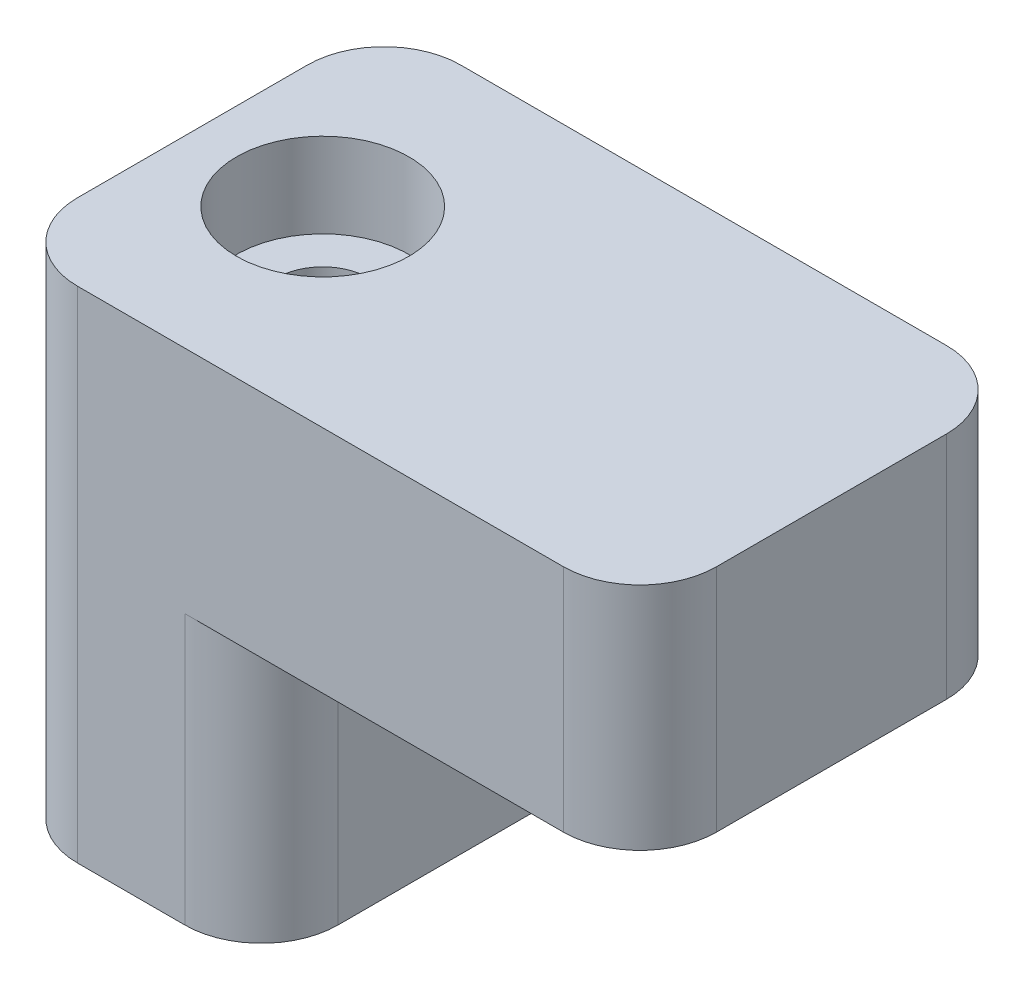
ISO-10303-21;
HEADER;
FILE_DESCRIPTION(('STEP AP214'),'2;1');
FILE_NAME('part.step','',(''),(''),'','','');
FILE_SCHEMA(('AUTOMOTIVE_DESIGN { 1 0 10303 214 1 1 1 1 }'));
ENDSEC;
DATA;
#1=APPLICATION_CONTEXT('core data for automotive mechanical design processes');
#2=APPLICATION_PROTOCOL_DEFINITION('international standard','automotive_design',2000,#1);
#3=PRODUCT_CONTEXT('',#1,'mechanical');
#4=PRODUCT('Part','Part','',(#3));
#5=PRODUCT_RELATED_PRODUCT_CATEGORY('part','',(#4));
#6=PRODUCT_DEFINITION_FORMATION('','',#4);
#7=PRODUCT_DEFINITION_CONTEXT('part definition',#1,'design');
#8=PRODUCT_DEFINITION('design','',#6,#7);
#9=PRODUCT_DEFINITION_SHAPE('','',#8);
#10=(LENGTH_UNIT() NAMED_UNIT(*) SI_UNIT(.MILLI.,.METRE.));
#11=(NAMED_UNIT(*) PLANE_ANGLE_UNIT() SI_UNIT($,.RADIAN.));
#12=(NAMED_UNIT(*) SI_UNIT($,.STERADIAN.) SOLID_ANGLE_UNIT());
#13=UNCERTAINTY_MEASURE_WITH_UNIT(LENGTH_MEASURE(1.E-05),#10,'distance_accuracy_value','');
#14=(GEOMETRIC_REPRESENTATION_CONTEXT(3) GLOBAL_UNCERTAINTY_ASSIGNED_CONTEXT((#13)) GLOBAL_UNIT_ASSIGNED_CONTEXT((#10,
#11,#12)) REPRESENTATION_CONTEXT('',''));
#15=CARTESIAN_POINT('',(0.,0.,0.));
#16=DIRECTION('',(0.,0.,1.));
#17=DIRECTION('',(1.,0.,0.));
#18=AXIS2_PLACEMENT_3D('',#15,#16,#17);
#19=CARTESIAN_POINT('',(10.795,0.,-15.875));
#20=DIRECTION('',(0.,-1.,0.));
#21=DIRECTION('',(1.,0.,0.));
#22=AXIS2_PLACEMENT_3D('',#19,#20,#21);
#23=PLANE('',#22);
#24=CARTESIAN_POINT('',(5.3975,0.,-7.9375));
#25=DIRECTION('',(0.,1.,0.));
#26=DIRECTION('',(0.,0.,1.));
#27=AXIS2_PLACEMENT_3D('',#24,#25,#26);
#28=CIRCLE('',#27,1.89864999999999);
#29=CARTESIAN_POINT('',(5.3975,0.,-6.03885));
#30=VERTEX_POINT('',#29);
#31=EDGE_CURVE('E254',#30,#30,#28,.T.);
#32=ORIENTED_EDGE('',*,*,#31,.T.);
#33=EDGE_LOOP('',(#32));
#34=FACE_BOUND('',#33,.T.);
#35=DIRECTION('',(1.,0.,0.));
#36=VECTOR('',#35,1.);
#37=CARTESIAN_POINT('',(10.795,0.,-15.875));
#38=LINE('',#37,#36);
#39=CARTESIAN_POINT('',(3.175,0.,-15.875));
#40=VERTEX_POINT('',#39);
#41=CARTESIAN_POINT('',(7.62,0.,-15.875));
#42=VERTEX_POINT('',#41);
#43=EDGE_CURVE('E258',#40,#42,#38,.T.);
#44=ORIENTED_EDGE('',*,*,#43,.T.);
#45=CARTESIAN_POINT('',(7.62,0.,-12.7));
#46=DIRECTION('',(0.,-1.,0.));
#47=DIRECTION('',(1.,0.,0.));
#48=AXIS2_PLACEMENT_3D('',#45,#46,#47);
#49=CIRCLE('',#48,3.175);
#50=CARTESIAN_POINT('',(10.795,0.,-12.7));
#51=VERTEX_POINT('',#50);
#52=EDGE_CURVE('E307',#42,#51,#49,.T.);
#53=ORIENTED_EDGE('',*,*,#52,.T.);
#54=DIRECTION('',(0.,0.,1.));
#55=VECTOR('',#54,1.);
#56=CARTESIAN_POINT('',(10.795,0.,-15.875));
#57=LINE('',#56,#55);
#58=CARTESIAN_POINT('',(10.795,0.,-3.175));
#59=VERTEX_POINT('',#58);
#60=EDGE_CURVE('E267',#51,#59,#57,.T.);
#61=ORIENTED_EDGE('',*,*,#60,.T.);
#62=CARTESIAN_POINT('',(7.62,0.,-3.175));
#63=DIRECTION('',(0.,-1.,0.));
#64=DIRECTION('',(1.,0.,0.));
#65=AXIS2_PLACEMENT_3D('',#62,#63,#64);
#66=CIRCLE('',#65,3.175);
#67=CARTESIAN_POINT('',(7.62,0.,0.));
#68=VERTEX_POINT('',#67);
#69=EDGE_CURVE('E305',#59,#68,#66,.T.);
#70=ORIENTED_EDGE('',*,*,#69,.T.);
#71=DIRECTION('',(1.,0.,0.));
#72=VECTOR('',#71,1.);
#73=CARTESIAN_POINT('',(10.795,0.,0.));
#74=LINE('',#73,#72);
#75=CARTESIAN_POINT('',(3.175,0.,0.));
#76=VERTEX_POINT('',#75);
#77=EDGE_CURVE('E257',#76,#68,#74,.T.);
#78=ORIENTED_EDGE('',*,*,#77,.F.);
#79=CARTESIAN_POINT('',(3.175,0.,-3.175));
#80=DIRECTION('',(0.,-1.,0.));
#81=DIRECTION('',(1.,0.,0.));
#82=AXIS2_PLACEMENT_3D('',#79,#80,#81);
#83=CIRCLE('',#82,3.175);
#84=CARTESIAN_POINT('',(0.,0.,-3.175));
#85=VERTEX_POINT('',#84);
#86=EDGE_CURVE('E301',#76,#85,#83,.T.);
#87=ORIENTED_EDGE('',*,*,#86,.T.);
#88=DIRECTION('',(0.,0.,1.));
#89=VECTOR('',#88,1.);
#90=CARTESIAN_POINT('',(0.,0.,-15.875));
#91=LINE('',#90,#89);
#92=CARTESIAN_POINT('',(0.,0.,-12.7));
#93=VERTEX_POINT('',#92);
#94=EDGE_CURVE('E275',#93,#85,#91,.T.);
#95=ORIENTED_EDGE('',*,*,#94,.F.);
#96=CARTESIAN_POINT('',(3.175,0.,-12.7));
#97=DIRECTION('',(0.,-1.,0.));
#98=DIRECTION('',(1.,0.,0.));
#99=AXIS2_PLACEMENT_3D('',#96,#97,#98);
#100=CIRCLE('',#99,3.175);
#101=EDGE_CURVE('E303',#93,#40,#100,.T.);
#102=ORIENTED_EDGE('',*,*,#101,.T.);
#103=EDGE_LOOP('',(#44,#53,#61,#70,#78,#87,#95,#102));
#104=FACE_BOUND('',#103,.T.);
#105=ADVANCED_FACE('F33',(#34,#104),#23,.T.);
#106=CARTESIAN_POINT('',(0.,0.,-15.875));
#107=DIRECTION('',(-1.,0.,0.));
#108=DIRECTION('',(0.,0.,1.));
#109=AXIS2_PLACEMENT_3D('',#106,#107,#108);
#110=PLANE('',#109);
#111=DIRECTION('',(0.,0.,1.));
#112=VECTOR('',#111,1.);
#113=CARTESIAN_POINT('',(0.,20.701,-15.875));
#114=LINE('',#113,#112);
#115=CARTESIAN_POINT('',(0.,20.701,-12.7));
#116=VERTEX_POINT('',#115);
#117=CARTESIAN_POINT('',(0.,20.701,-3.175));
#118=VERTEX_POINT('',#117);
#119=EDGE_CURVE('E279',#116,#118,#114,.T.);
#120=ORIENTED_EDGE('',*,*,#119,.F.);
#121=DIRECTION('',(0.,-1.,0.));
#122=VECTOR('',#121,1.);
#123=CARTESIAN_POINT('',(0.,0.,-12.7));
#124=LINE('',#123,#122);
#125=EDGE_CURVE('E320',#116,#93,#124,.T.);
#126=ORIENTED_EDGE('',*,*,#125,.T.);
#127=ORIENTED_EDGE('',*,*,#94,.T.);
#128=DIRECTION('',(0.,-1.,0.));
#129=VECTOR('',#128,1.);
#130=CARTESIAN_POINT('',(0.,20.701,-3.175));
#131=LINE('',#130,#129);
#132=EDGE_CURVE('E318',#85,#118,#131,.F.);
#133=ORIENTED_EDGE('',*,*,#132,.T.);
#134=EDGE_LOOP('',(#120,#126,#127,#133));
#135=FACE_BOUND('',#134,.T.);
#136=ADVANCED_FACE('F358',(#135),#110,.T.);
#137=CARTESIAN_POINT('',(0.,20.701,-15.875));
#138=DIRECTION('',(0.,1.,0.));
#139=DIRECTION('',(-1.,0.,0.));
#140=AXIS2_PLACEMENT_3D('',#137,#138,#139);
#141=PLANE('',#140);
#142=CARTESIAN_POINT('',(5.3975,20.701,-7.9375));
#143=DIRECTION('',(0.,1.,0.));
#144=DIRECTION('',(0.,0.,1.));
#145=AXIS2_PLACEMENT_3D('',#142,#143,#144);
#146=CIRCLE('',#145,3.57250999999999);
#147=CARTESIAN_POINT('',(5.3975,20.701,-4.36499));
#148=VERTEX_POINT('',#147);
#149=EDGE_CURVE('E239',#148,#148,#146,.T.);
#150=ORIENTED_EDGE('',*,*,#149,.F.);
#151=EDGE_LOOP('',(#150));
#152=FACE_BOUND('',#151,.T.);
#153=DIRECTION('',(-1.,0.,0.));
#154=VECTOR('',#153,1.);
#155=CARTESIAN_POINT('',(0.,20.701,-15.875));
#156=LINE('',#155,#154);
#157=CARTESIAN_POINT('',(23.3045,20.701,-15.875));
#158=VERTEX_POINT('',#157);
#159=CARTESIAN_POINT('',(3.175,20.701,-15.875));
#160=VERTEX_POINT('',#159);
#161=EDGE_CURVE('E264',#158,#160,#156,.T.);
#162=ORIENTED_EDGE('',*,*,#161,.T.);
#163=CARTESIAN_POINT('',(3.175,20.701,-12.7));
#164=DIRECTION('',(0.,1.,0.));
#165=DIRECTION('',(-1.,0.,0.));
#166=AXIS2_PLACEMENT_3D('',#163,#164,#165);
#167=CIRCLE('',#166,3.175);
#168=EDGE_CURVE('E329',#160,#116,#167,.T.);
#169=ORIENTED_EDGE('',*,*,#168,.T.);
#170=ORIENTED_EDGE('',*,*,#119,.T.);
#171=CARTESIAN_POINT('',(3.175,20.701,-3.175));
#172=DIRECTION('',(0.,1.,0.));
#173=DIRECTION('',(-1.,0.,0.));
#174=AXIS2_PLACEMENT_3D('',#171,#172,#173);
#175=CIRCLE('',#174,3.175);
#176=CARTESIAN_POINT('',(3.175,20.701,0.));
#177=VERTEX_POINT('',#176);
#178=EDGE_CURVE('E327',#118,#177,#175,.T.);
#179=ORIENTED_EDGE('',*,*,#178,.T.);
#180=DIRECTION('',(-1.,0.,0.));
#181=VECTOR('',#180,1.);
#182=CARTESIAN_POINT('',(0.,20.701,0.));
#183=LINE('',#182,#181);
#184=CARTESIAN_POINT('',(23.3045,20.701,0.));
#185=VERTEX_POINT('',#184);
#186=EDGE_CURVE('E262',#185,#177,#183,.T.);
#187=ORIENTED_EDGE('',*,*,#186,.F.);
#188=CARTESIAN_POINT('',(23.3045,20.701,-3.175));
#189=DIRECTION('',(0.,1.,0.));
#190=DIRECTION('',(-1.,0.,0.));
#191=AXIS2_PLACEMENT_3D('',#188,#189,#190);
#192=CIRCLE('',#191,3.175);
#193=CARTESIAN_POINT('',(26.4795,20.701,-3.175));
#194=VERTEX_POINT('',#193);
#195=EDGE_CURVE('E323',#185,#194,#192,.T.);
#196=ORIENTED_EDGE('',*,*,#195,.T.);
#197=DIRECTION('',(0.,0.,1.));
#198=VECTOR('',#197,1.);
#199=CARTESIAN_POINT('',(26.4795,20.701,-15.875));
#200=LINE('',#199,#198);
#201=CARTESIAN_POINT('',(26.4795,20.701,-12.7));
#202=VERTEX_POINT('',#201);
#203=EDGE_CURVE('E282',#202,#194,#200,.T.);
#204=ORIENTED_EDGE('',*,*,#203,.F.);
#205=CARTESIAN_POINT('',(23.3045,20.701,-12.7));
#206=DIRECTION('',(0.,1.,0.));
#207=DIRECTION('',(-1.,0.,0.));
#208=AXIS2_PLACEMENT_3D('',#205,#206,#207);
#209=CIRCLE('',#208,3.175);
#210=EDGE_CURVE('E325',#202,#158,#209,.T.);
#211=ORIENTED_EDGE('',*,*,#210,.T.);
#212=EDGE_LOOP('',(#162,#169,#170,#179,#187,#196,#204,#211));
#213=FACE_BOUND('',#212,.T.);
#214=ADVANCED_FACE('F362',(#152,#213),#141,.T.);
#215=CARTESIAN_POINT('',(26.4795,20.701,-15.875));
#216=DIRECTION('',(1.,0.,0.));
#217=DIRECTION('',(0.,0.,-1.));
#218=AXIS2_PLACEMENT_3D('',#215,#216,#217);
#219=PLANE('',#218);
#220=DIRECTION('',(0.,0.,1.));
#221=VECTOR('',#220,1.);
#222=CARTESIAN_POINT('',(26.4795,11.176,-15.875));
#223=LINE('',#222,#221);
#224=CARTESIAN_POINT('',(26.4795,11.176,-12.7));
#225=VERTEX_POINT('',#224);
#226=CARTESIAN_POINT('',(26.4795,11.176,-3.175));
#227=VERTEX_POINT('',#226);
#228=EDGE_CURVE('E284',#225,#227,#223,.T.);
#229=ORIENTED_EDGE('',*,*,#228,.F.);
#230=DIRECTION('',(0.,1.,0.));
#231=VECTOR('',#230,1.);
#232=CARTESIAN_POINT('',(26.4795,20.701,-12.7));
#233=LINE('',#232,#231);
#234=EDGE_CURVE('E332',#225,#202,#233,.T.);
#235=ORIENTED_EDGE('',*,*,#234,.T.);
#236=ORIENTED_EDGE('',*,*,#203,.T.);
#237=DIRECTION('',(0.,1.,0.));
#238=VECTOR('',#237,1.);
#239=CARTESIAN_POINT('',(26.4795,11.176,-3.175));
#240=LINE('',#239,#238);
#241=EDGE_CURVE('E48',#194,#227,#240,.F.);
#242=ORIENTED_EDGE('',*,*,#241,.T.);
#243=EDGE_LOOP('',(#229,#235,#236,#242));
#244=FACE_BOUND('',#243,.T.);
#245=ADVANCED_FACE('F380',(#244),#219,.T.);
#246=CARTESIAN_POINT('',(26.4795,11.176,-15.875));
#247=DIRECTION('',(0.,-1.,0.));
#248=DIRECTION('',(1.,0.,0.));
#249=AXIS2_PLACEMENT_3D('',#246,#247,#248);
#250=PLANE('',#249);
#251=CARTESIAN_POINT('',(20.3835,11.176,-13.2715));
#252=DIRECTION('',(0.,-1.,0.));
#253=DIRECTION('',(1.,0.,0.));
#254=AXIS2_PLACEMENT_3D('',#251,#252,#253);
#255=CIRCLE('',#254,0.396875000000001);
#256=CARTESIAN_POINT('',(20.3835,11.176,-12.874625));
#257=VERTEX_POINT('',#256);
#258=CARTESIAN_POINT('',(20.3835,11.176,-13.668375));
#259=VERTEX_POINT('',#258);
#260=EDGE_CURVE('E178',#257,#259,#255,.T.);
#261=ORIENTED_EDGE('',*,*,#260,.F.);
#262=DIRECTION('',(-1.,0.,0.));
#263=VECTOR('',#262,1.);
#264=CARTESIAN_POINT('',(20.3835,11.176,-12.874625));
#265=LINE('',#264,#263);
#266=CARTESIAN_POINT('',(24.9555,11.176,-12.874625));
#267=VERTEX_POINT('',#266);
#268=EDGE_CURVE('E195',#267,#257,#265,.T.);
#269=ORIENTED_EDGE('',*,*,#268,.F.);
#270=CARTESIAN_POINT('',(24.9555,11.176,-13.2715));
#271=DIRECTION('',(0.,-1.,0.));
#272=DIRECTION('',(1.,0.,0.));
#273=AXIS2_PLACEMENT_3D('',#270,#271,#272);
#274=CIRCLE('',#273,0.396875000000001);
#275=CARTESIAN_POINT('',(24.9555,11.176,-13.668375));
#276=VERTEX_POINT('',#275);
#277=EDGE_CURVE('E198',#276,#267,#274,.T.);
#278=ORIENTED_EDGE('',*,*,#277,.F.);
#279=DIRECTION('',(1.,0.,0.));
#280=VECTOR('',#279,1.);
#281=CARTESIAN_POINT('',(20.3835,11.176,-13.668375));
#282=LINE('',#281,#280);
#283=EDGE_CURVE('E204',#259,#276,#282,.T.);
#284=ORIENTED_EDGE('',*,*,#283,.F.);
#285=EDGE_LOOP('',(#261,#269,#278,#284));
#286=FACE_BOUND('',#285,.T.);
#287=CARTESIAN_POINT('',(20.3835,11.176,-2.6035));
#288=DIRECTION('',(0.,-1.,0.));
#289=DIRECTION('',(1.,0.,0.));
#290=AXIS2_PLACEMENT_3D('',#287,#288,#289);
#291=CIRCLE('',#290,0.396875);
#292=CARTESIAN_POINT('',(20.3835,11.176,-2.206625));
#293=VERTEX_POINT('',#292);
#294=CARTESIAN_POINT('',(20.3835,11.176,-3.000375));
#295=VERTEX_POINT('',#294);
#296=EDGE_CURVE('E210',#293,#295,#291,.T.);
#297=ORIENTED_EDGE('',*,*,#296,.F.);
#298=DIRECTION('',(-1.,0.,0.));
#299=VECTOR('',#298,1.);
#300=CARTESIAN_POINT('',(20.3835,11.176,-2.206625));
#301=LINE('',#300,#299);
#302=CARTESIAN_POINT('',(24.9555,11.176,-2.206625));
#303=VERTEX_POINT('',#302);
#304=EDGE_CURVE('E218',#303,#293,#301,.T.);
#305=ORIENTED_EDGE('',*,*,#304,.F.);
#306=CARTESIAN_POINT('',(24.9555,11.176,-2.6035));
#307=DIRECTION('',(0.,-1.,0.));
#308=DIRECTION('',(1.,0.,0.));
#309=AXIS2_PLACEMENT_3D('',#306,#307,#308);
#310=CIRCLE('',#309,0.396875);
#311=CARTESIAN_POINT('',(24.9555,11.176,-3.000375));
#312=VERTEX_POINT('',#311);
#313=EDGE_CURVE('E232',#312,#303,#310,.T.);
#314=ORIENTED_EDGE('',*,*,#313,.F.);
#315=DIRECTION('',(1.,0.,0.));
#316=VECTOR('',#315,1.);
#317=CARTESIAN_POINT('',(20.3835,11.176,-3.000375));
#318=LINE('',#317,#316);
#319=EDGE_CURVE('E229',#295,#312,#318,.T.);
#320=ORIENTED_EDGE('',*,*,#319,.F.);
#321=EDGE_LOOP('',(#297,#305,#314,#320));
#322=FACE_BOUND('',#321,.T.);
#323=DIRECTION('',(1.,0.,0.));
#324=VECTOR('',#323,1.);
#325=CARTESIAN_POINT('',(26.4795,11.176,-15.875));
#326=LINE('',#325,#324);
#327=CARTESIAN_POINT('',(7.62,11.176,-15.875));
#328=VERTEX_POINT('',#327);
#329=CARTESIAN_POINT('',(23.3045,11.176,-15.875));
#330=VERTEX_POINT('',#329);
#331=EDGE_CURVE('E261',#328,#330,#326,.T.);
#332=ORIENTED_EDGE('',*,*,#331,.T.);
#333=CARTESIAN_POINT('',(23.3045,11.176,-12.7));
#334=DIRECTION('',(0.,-1.,0.));
#335=DIRECTION('',(1.,0.,0.));
#336=AXIS2_PLACEMENT_3D('',#333,#334,#335);
#337=CIRCLE('',#336,3.175);
#338=EDGE_CURVE('E55',#330,#225,#337,.T.);
#339=ORIENTED_EDGE('',*,*,#338,.T.);
#340=ORIENTED_EDGE('',*,*,#228,.T.);
#341=CARTESIAN_POINT('',(23.3045,11.176,-3.175));
#342=DIRECTION('',(0.,-1.,0.));
#343=DIRECTION('',(1.,0.,0.));
#344=AXIS2_PLACEMENT_3D('',#341,#342,#343);
#345=CIRCLE('',#344,3.175);
#346=CARTESIAN_POINT('',(23.3045,11.176,0.));
#347=VERTEX_POINT('',#346);
#348=EDGE_CURVE('E335',#227,#347,#345,.T.);
#349=ORIENTED_EDGE('',*,*,#348,.T.);
#350=DIRECTION('',(1.,0.,0.));
#351=VECTOR('',#350,1.);
#352=CARTESIAN_POINT('',(26.4795,11.176,0.));
#353=LINE('',#352,#351);
#354=CARTESIAN_POINT('',(7.62,11.176,0.));
#355=VERTEX_POINT('',#354);
#356=EDGE_CURVE('E270',#355,#347,#353,.T.);
#357=ORIENTED_EDGE('',*,*,#356,.F.);
#358=CARTESIAN_POINT('',(7.62,11.176,-3.175));
#359=DIRECTION('',(0.,-1.,0.));
#360=DIRECTION('',(1.,0.,0.));
#361=AXIS2_PLACEMENT_3D('',#358,#359,#360);
#362=CIRCLE('',#361,3.175);
#363=CARTESIAN_POINT('',(10.795,11.176,-3.175));
#364=VERTEX_POINT('',#363);
#365=EDGE_CURVE('E11',#355,#364,#362,.F.);
#366=ORIENTED_EDGE('',*,*,#365,.T.);
#367=DIRECTION('',(0.,0.,1.));
#368=VECTOR('',#367,1.);
#369=CARTESIAN_POINT('',(10.795,11.176,-15.875));
#370=LINE('',#369,#368);
#371=CARTESIAN_POINT('',(10.795,11.176,-12.7));
#372=VERTEX_POINT('',#371);
#373=EDGE_CURVE('E286',#372,#364,#370,.T.);
#374=ORIENTED_EDGE('',*,*,#373,.F.);
#375=CARTESIAN_POINT('',(7.62,11.176,-12.7));
#376=DIRECTION('',(0.,-1.,0.));
#377=DIRECTION('',(1.,0.,0.));
#378=AXIS2_PLACEMENT_3D('',#375,#376,#377);
#379=CIRCLE('',#378,3.175);
#380=EDGE_CURVE('E41',#372,#328,#379,.F.);
#381=ORIENTED_EDGE('',*,*,#380,.T.);
#382=EDGE_LOOP('',(#332,#339,#340,#349,#357,#366,#374,#381));
#383=FACE_BOUND('',#382,.T.);
#384=ADVANCED_FACE('F340',(#286,#322,#383),#250,.T.);
#385=CARTESIAN_POINT('',(10.795,11.176,-15.875));
#386=DIRECTION('',(1.,0.,0.));
#387=DIRECTION('',(0.,1.,0.));
#388=AXIS2_PLACEMENT_3D('',#385,#386,#387);
#389=PLANE('',#388);
#390=ORIENTED_EDGE('',*,*,#60,.F.);
#391=DIRECTION('',(0.,1.,0.));
#392=VECTOR('',#391,1.);
#393=CARTESIAN_POINT('',(10.795,11.176,-12.7));
#394=LINE('',#393,#392);
#395=EDGE_CURVE('E292',#51,#372,#394,.T.);
#396=ORIENTED_EDGE('',*,*,#395,.T.);
#397=ORIENTED_EDGE('',*,*,#373,.T.);
#398=DIRECTION('',(0.,1.,0.));
#399=VECTOR('',#398,1.);
#400=CARTESIAN_POINT('',(10.795,0.,-3.175));
#401=LINE('',#400,#399);
#402=EDGE_CURVE('E278',#364,#59,#401,.F.);
#403=ORIENTED_EDGE('',*,*,#402,.T.);
#404=EDGE_LOOP('',(#390,#396,#397,#403));
#405=FACE_BOUND('',#404,.T.);
#406=ADVANCED_FACE('F402',(#405),#389,.T.);
#407=CARTESIAN_POINT('',(0.,0.,-15.875));
#408=DIRECTION('',(0.,0.,-1.));
#409=DIRECTION('',(-1.,0.,0.));
#410=AXIS2_PLACEMENT_3D('',#407,#408,#409);
#411=PLANE('',#410);
#412=ORIENTED_EDGE('',*,*,#331,.F.);
#413=DIRECTION('',(0.,1.,0.));
#414=VECTOR('',#413,1.);
#415=CARTESIAN_POINT('',(7.62,0.,-15.875));
#416=LINE('',#415,#414);
#417=EDGE_CURVE('E299',#328,#42,#416,.F.);
#418=ORIENTED_EDGE('',*,*,#417,.T.);
#419=ORIENTED_EDGE('',*,*,#43,.F.);
#420=DIRECTION('',(0.,-1.,0.));
#421=VECTOR('',#420,1.);
#422=CARTESIAN_POINT('',(3.175,0.,-15.875));
#423=LINE('',#422,#421);
#424=EDGE_CURVE('E297',#40,#160,#423,.F.);
#425=ORIENTED_EDGE('',*,*,#424,.T.);
#426=ORIENTED_EDGE('',*,*,#161,.F.);
#427=DIRECTION('',(0.,1.,0.));
#428=VECTOR('',#427,1.);
#429=CARTESIAN_POINT('',(23.3045,0.,-15.875));
#430=LINE('',#429,#428);
#431=EDGE_CURVE('E295',#158,#330,#430,.F.);
#432=ORIENTED_EDGE('',*,*,#431,.T.);
#433=EDGE_LOOP('',(#412,#418,#419,#425,#426,#432));
#434=FACE_BOUND('',#433,.T.);
#435=ADVANCED_FACE('F347',(#434),#411,.T.);
#436=CARTESIAN_POINT('',(0.,0.,0.));
#437=DIRECTION('',(0.,0.,-1.));
#438=DIRECTION('',(-1.,0.,0.));
#439=AXIS2_PLACEMENT_3D('',#436,#437,#438);
#440=PLANE('',#439);
#441=ORIENTED_EDGE('',*,*,#77,.T.);
#442=DIRECTION('',(0.,1.,0.));
#443=VECTOR('',#442,1.);
#444=CARTESIAN_POINT('',(7.62,11.176,0.));
#445=LINE('',#444,#443);
#446=EDGE_CURVE('E315',#68,#355,#445,.T.);
#447=ORIENTED_EDGE('',*,*,#446,.T.);
#448=ORIENTED_EDGE('',*,*,#356,.T.);
#449=DIRECTION('',(0.,1.,0.));
#450=VECTOR('',#449,1.);
#451=CARTESIAN_POINT('',(23.3045,20.701,0.));
#452=LINE('',#451,#450);
#453=EDGE_CURVE('E309',#347,#185,#452,.T.);
#454=ORIENTED_EDGE('',*,*,#453,.T.);
#455=ORIENTED_EDGE('',*,*,#186,.T.);
#456=DIRECTION('',(0.,-1.,0.));
#457=VECTOR('',#456,1.);
#458=CARTESIAN_POINT('',(3.175,0.,0.));
#459=LINE('',#458,#457);
#460=EDGE_CURVE('E312',#177,#76,#459,.T.);
#461=ORIENTED_EDGE('',*,*,#460,.T.);
#462=EDGE_LOOP('',(#441,#447,#448,#454,#455,#461));
#463=FACE_BOUND('',#462,.T.);
#464=ADVANCED_FACE('F369',(#463),#440,.F.);
#465=CARTESIAN_POINT('',(5.3975,20.701,-7.9375));
#466=DIRECTION('',(0.,1.,0.));
#467=DIRECTION('',(0.,0.,1.));
#468=AXIS2_PLACEMENT_3D('',#465,#466,#467);
#469=CYLINDRICAL_SURFACE('',#468,1.89865);
#470=ORIENTED_EDGE('',*,*,#31,.F.);
#471=EDGE_LOOP('',(#470));
#472=FACE_BOUND('',#471,.T.);
#473=CARTESIAN_POINT('',(5.3975,17.1958,-7.9375));
#474=DIRECTION('',(0.,1.,0.));
#475=DIRECTION('',(0.,0.,1.));
#476=AXIS2_PLACEMENT_3D('',#473,#474,#475);
#477=CIRCLE('',#476,1.89865);
#478=CARTESIAN_POINT('',(5.3975,17.1958,-6.03885));
#479=VERTEX_POINT('',#478);
#480=EDGE_CURVE('E251',#479,#479,#477,.T.);
#481=ORIENTED_EDGE('',*,*,#480,.T.);
#482=EDGE_LOOP('',(#481));
#483=FACE_BOUND('',#482,.T.);
#484=ADVANCED_FACE('F542',(#472,#483),#469,.F.);
#485=CARTESIAN_POINT('',(7.29615,17.1958,-7.9375));
#486=DIRECTION('',(0.,-1.,0.));
#487=DIRECTION('',(0.,0.,-1.));
#488=AXIS2_PLACEMENT_3D('',#485,#486,#487);
#489=PLANE('',#488);
#490=ORIENTED_EDGE('',*,*,#480,.F.);
#491=EDGE_LOOP('',(#490));
#492=FACE_BOUND('',#491,.T.);
#493=CARTESIAN_POINT('',(5.3975,17.1958,-7.9375));
#494=DIRECTION('',(0.,1.,0.));
#495=DIRECTION('',(0.,0.,1.));
#496=AXIS2_PLACEMENT_3D('',#493,#494,#495);
#497=CIRCLE('',#496,3.57250999999999);
#498=CARTESIAN_POINT('',(5.3975,17.1958,-4.36499));
#499=VERTEX_POINT('',#498);
#500=EDGE_CURVE('E248',#499,#499,#497,.T.);
#501=ORIENTED_EDGE('',*,*,#500,.T.);
#502=EDGE_LOOP('',(#501));
#503=FACE_BOUND('',#502,.T.);
#504=ADVANCED_FACE('F533',(#492,#503),#489,.F.);
#505=CARTESIAN_POINT('',(5.3975,20.701,-7.9375));
#506=DIRECTION('',(0.,1.,0.));
#507=DIRECTION('',(0.,0.,1.));
#508=AXIS2_PLACEMENT_3D('',#505,#506,#507);
#509=CYLINDRICAL_SURFACE('',#508,3.57250999999999);
#510=ORIENTED_EDGE('',*,*,#500,.F.);
#511=EDGE_LOOP('',(#510));
#512=FACE_BOUND('',#511,.T.);
#513=ORIENTED_EDGE('',*,*,#149,.T.);
#514=EDGE_LOOP('',(#513));
#515=FACE_BOUND('',#514,.T.);
#516=ADVANCED_FACE('F524',(#512,#515),#509,.F.);
#517=CARTESIAN_POINT('',(20.3835,13.716,-2.6035));
#518=DIRECTION('',(0.,-1.,0.));
#519=DIRECTION('',(1.,0.,0.));
#520=AXIS2_PLACEMENT_3D('',#517,#518,#519);
#521=CYLINDRICAL_SURFACE('',#520,0.396875);
#522=ORIENTED_EDGE('',*,*,#296,.T.);
#523=DIRECTION('',(0.,-1.,0.));
#524=VECTOR('',#523,1.);
#525=CARTESIAN_POINT('',(20.3835,13.716,-3.000375));
#526=LINE('',#525,#524);
#527=CARTESIAN_POINT('',(20.3835,13.716,-3.000375));
#528=VERTEX_POINT('',#527);
#529=EDGE_CURVE('E227',#528,#295,#526,.T.);
#530=ORIENTED_EDGE('',*,*,#529,.F.);
#531=CARTESIAN_POINT('',(20.3835,13.716,-2.6035));
#532=DIRECTION('',(0.,-1.,0.));
#533=DIRECTION('',(1.,0.,0.));
#534=AXIS2_PLACEMENT_3D('',#531,#532,#533);
#535=CIRCLE('',#534,0.396875);
#536=CARTESIAN_POINT('',(20.3835,13.716,-2.206625));
#537=VERTEX_POINT('',#536);
#538=EDGE_CURVE('E214',#537,#528,#535,.T.);
#539=ORIENTED_EDGE('',*,*,#538,.F.);
#540=DIRECTION('',(0.,-1.,0.));
#541=VECTOR('',#540,1.);
#542=CARTESIAN_POINT('',(20.3835,13.716,-2.206625));
#543=LINE('',#542,#541);
#544=EDGE_CURVE('E237',#537,#293,#543,.T.);
#545=ORIENTED_EDGE('',*,*,#544,.T.);
#546=EDGE_LOOP('',(#522,#530,#539,#545));
#547=FACE_BOUND('',#546,.T.);
#548=ADVANCED_FACE('F515',(#547),#521,.F.);
#549=CARTESIAN_POINT('',(20.3835,13.716,-2.206625));
#550=DIRECTION('',(0.,0.,1.));
#551=DIRECTION('',(1.,0.,0.));
#552=AXIS2_PLACEMENT_3D('',#549,#550,#551);
#553=PLANE('',#552);
#554=ORIENTED_EDGE('',*,*,#304,.T.);
#555=ORIENTED_EDGE('',*,*,#544,.F.);
#556=DIRECTION('',(-1.,0.,0.));
#557=VECTOR('',#556,1.);
#558=CARTESIAN_POINT('',(20.3835,13.716,-2.206625));
#559=LINE('',#558,#557);
#560=CARTESIAN_POINT('',(24.9555,13.716,-2.206625));
#561=VERTEX_POINT('',#560);
#562=EDGE_CURVE('E224',#561,#537,#559,.T.);
#563=ORIENTED_EDGE('',*,*,#562,.F.);
#564=DIRECTION('',(0.,-1.,0.));
#565=VECTOR('',#564,1.);
#566=CARTESIAN_POINT('',(24.9555,13.716,-2.206625));
#567=LINE('',#566,#565);
#568=EDGE_CURVE('E240',#561,#303,#567,.T.);
#569=ORIENTED_EDGE('',*,*,#568,.T.);
#570=EDGE_LOOP('',(#554,#555,#563,#569));
#571=FACE_BOUND('',#570,.T.);
#572=ADVANCED_FACE('F506',(#571),#553,.F.);
#573=CARTESIAN_POINT('',(24.9555,13.716,-2.6035));
#574=DIRECTION('',(0.,-1.,0.));
#575=DIRECTION('',(1.,0.,0.));
#576=AXIS2_PLACEMENT_3D('',#573,#574,#575);
#577=CYLINDRICAL_SURFACE('',#576,0.396875);
#578=ORIENTED_EDGE('',*,*,#313,.T.);
#579=ORIENTED_EDGE('',*,*,#568,.F.);
#580=CARTESIAN_POINT('',(24.9555,13.716,-2.6035));
#581=DIRECTION('',(0.,-1.,0.));
#582=DIRECTION('',(1.,0.,0.));
#583=AXIS2_PLACEMENT_3D('',#580,#581,#582);
#584=CIRCLE('',#583,0.396875);
#585=CARTESIAN_POINT('',(24.9555,13.716,-3.000375));
#586=VERTEX_POINT('',#585);
#587=EDGE_CURVE('E221',#586,#561,#584,.T.);
#588=ORIENTED_EDGE('',*,*,#587,.F.);
#589=DIRECTION('',(0.,-1.,0.));
#590=VECTOR('',#589,1.);
#591=CARTESIAN_POINT('',(24.9555,13.716,-3.000375));
#592=LINE('',#591,#590);
#593=EDGE_CURVE('E242',#586,#312,#592,.T.);
#594=ORIENTED_EDGE('',*,*,#593,.T.);
#595=EDGE_LOOP('',(#578,#579,#588,#594));
#596=FACE_BOUND('',#595,.T.);
#597=ADVANCED_FACE('F497',(#596),#577,.F.);
#598=CARTESIAN_POINT('',(20.3835,13.716,-3.000375));
#599=DIRECTION('',(0.,0.,-1.));
#600=DIRECTION('',(-1.,0.,0.));
#601=AXIS2_PLACEMENT_3D('',#598,#599,#600);
#602=PLANE('',#601);
#603=ORIENTED_EDGE('',*,*,#319,.T.);
#604=ORIENTED_EDGE('',*,*,#593,.F.);
#605=DIRECTION('',(1.,0.,0.));
#606=VECTOR('',#605,1.);
#607=CARTESIAN_POINT('',(20.3835,13.716,-3.000375));
#608=LINE('',#607,#606);
#609=EDGE_CURVE('E217',#528,#586,#608,.T.);
#610=ORIENTED_EDGE('',*,*,#609,.F.);
#611=ORIENTED_EDGE('',*,*,#529,.T.);
#612=EDGE_LOOP('',(#603,#604,#610,#611));
#613=FACE_BOUND('',#612,.T.);
#614=ADVANCED_FACE('F488',(#613),#602,.F.);
#615=CARTESIAN_POINT('',(20.3835,13.716,-2.6035));
#616=DIRECTION('',(0.,-1.,0.));
#617=DIRECTION('',(1.,0.,0.));
#618=AXIS2_PLACEMENT_3D('',#615,#616,#617);
#619=PLANE('',#618);
#620=ORIENTED_EDGE('',*,*,#538,.T.);
#621=ORIENTED_EDGE('',*,*,#609,.T.);
#622=ORIENTED_EDGE('',*,*,#587,.T.);
#623=ORIENTED_EDGE('',*,*,#562,.T.);
#624=EDGE_LOOP('',(#620,#621,#622,#623));
#625=FACE_BOUND('',#624,.T.);
#626=ADVANCED_FACE('F480',(#625),#619,.T.);
#627=CARTESIAN_POINT('',(20.3835,13.716,-13.2715));
#628=DIRECTION('',(0.,-1.,0.));
#629=DIRECTION('',(1.,0.,0.));
#630=AXIS2_PLACEMENT_3D('',#627,#628,#629);
#631=CYLINDRICAL_SURFACE('',#630,0.396875000000001);
#632=ORIENTED_EDGE('',*,*,#260,.T.);
#633=DIRECTION('',(0.,-1.,0.));
#634=VECTOR('',#633,1.);
#635=CARTESIAN_POINT('',(20.3835,13.716,-13.668375));
#636=LINE('',#635,#634);
#637=CARTESIAN_POINT('',(20.3835,13.716,-13.668375));
#638=VERTEX_POINT('',#637);
#639=EDGE_CURVE('E171',#638,#259,#636,.T.);
#640=ORIENTED_EDGE('',*,*,#639,.F.);
#641=CARTESIAN_POINT('',(20.3835,13.716,-13.2715));
#642=DIRECTION('',(0.,-1.,0.));
#643=DIRECTION('',(1.,0.,0.));
#644=AXIS2_PLACEMENT_3D('',#641,#642,#643);
#645=CIRCLE('',#644,0.396875000000001);
#646=CARTESIAN_POINT('',(20.3835,13.716,-12.874625));
#647=VERTEX_POINT('',#646);
#648=EDGE_CURVE('E175',#647,#638,#645,.T.);
#649=ORIENTED_EDGE('',*,*,#648,.F.);
#650=DIRECTION('',(0.,-1.,0.));
#651=VECTOR('',#650,1.);
#652=CARTESIAN_POINT('',(20.3835,13.716,-12.874625));
#653=LINE('',#652,#651);
#654=EDGE_CURVE('E208',#647,#257,#653,.T.);
#655=ORIENTED_EDGE('',*,*,#654,.T.);
#656=EDGE_LOOP('',(#632,#640,#649,#655));
#657=FACE_BOUND('',#656,.T.);
#658=ADVANCED_FACE('F173',(#657),#631,.F.);
#659=CARTESIAN_POINT('',(20.3835,13.716,-12.874625));
#660=DIRECTION('',(0.,0.,1.));
#661=DIRECTION('',(1.,0.,0.));
#662=AXIS2_PLACEMENT_3D('',#659,#660,#661);
#663=PLANE('',#662);
#664=ORIENTED_EDGE('',*,*,#268,.T.);
#665=ORIENTED_EDGE('',*,*,#654,.F.);
#666=DIRECTION('',(-1.,0.,0.));
#667=VECTOR('',#666,1.);
#668=CARTESIAN_POINT('',(20.3835,13.716,-12.874625));
#669=LINE('',#668,#667);
#670=CARTESIAN_POINT('',(24.9555,13.716,-12.874625));
#671=VERTEX_POINT('',#670);
#672=EDGE_CURVE('E183',#671,#647,#669,.T.);
#673=ORIENTED_EDGE('',*,*,#672,.F.);
#674=DIRECTION('',(0.,-1.,0.));
#675=VECTOR('',#674,1.);
#676=CARTESIAN_POINT('',(24.9555,13.716,-12.874625));
#677=LINE('',#676,#675);
#678=EDGE_CURVE('E211',#671,#267,#677,.T.);
#679=ORIENTED_EDGE('',*,*,#678,.T.);
#680=EDGE_LOOP('',(#664,#665,#673,#679));
#681=FACE_BOUND('',#680,.T.);
#682=ADVANCED_FACE('F463',(#681),#663,.F.);
#683=CARTESIAN_POINT('',(24.9555,13.716,-13.2715));
#684=DIRECTION('',(0.,-1.,0.));
#685=DIRECTION('',(1.,0.,0.));
#686=AXIS2_PLACEMENT_3D('',#683,#684,#685);
#687=CYLINDRICAL_SURFACE('',#686,0.396875000000001);
#688=ORIENTED_EDGE('',*,*,#277,.T.);
#689=ORIENTED_EDGE('',*,*,#678,.F.);
#690=CARTESIAN_POINT('',(24.9555,13.716,-13.2715));
#691=DIRECTION('',(0.,-1.,0.));
#692=DIRECTION('',(1.,0.,0.));
#693=AXIS2_PLACEMENT_3D('',#690,#691,#692);
#694=CIRCLE('',#693,0.396875000000001);
#695=CARTESIAN_POINT('',(24.9555,13.716,-13.668375));
#696=VERTEX_POINT('',#695);
#697=EDGE_CURVE('E191',#696,#671,#694,.T.);
#698=ORIENTED_EDGE('',*,*,#697,.F.);
#699=DIRECTION('',(0.,-1.,0.));
#700=VECTOR('',#699,1.);
#701=CARTESIAN_POINT('',(24.9555,13.716,-13.668375));
#702=LINE('',#701,#700);
#703=EDGE_CURVE('E182',#696,#276,#702,.T.);
#704=ORIENTED_EDGE('',*,*,#703,.T.);
#705=EDGE_LOOP('',(#688,#689,#698,#704));
#706=FACE_BOUND('',#705,.T.);
#707=ADVANCED_FACE('F455',(#706),#687,.F.);
#708=CARTESIAN_POINT('',(20.3835,13.716,-13.668375));
#709=DIRECTION('',(0.,0.,-1.));
#710=DIRECTION('',(-1.,0.,0.));
#711=AXIS2_PLACEMENT_3D('',#708,#709,#710);
#712=PLANE('',#711);
#713=ORIENTED_EDGE('',*,*,#283,.T.);
#714=ORIENTED_EDGE('',*,*,#703,.F.);
#715=DIRECTION('',(1.,0.,0.));
#716=VECTOR('',#715,1.);
#717=CARTESIAN_POINT('',(20.3835,13.716,-13.668375));
#718=LINE('',#717,#716);
#719=EDGE_CURVE('E186',#638,#696,#718,.T.);
#720=ORIENTED_EDGE('',*,*,#719,.F.);
#721=ORIENTED_EDGE('',*,*,#639,.T.);
#722=EDGE_LOOP('',(#713,#714,#720,#721));
#723=FACE_BOUND('',#722,.T.);
#724=ADVANCED_FACE('F187',(#723),#712,.F.);
#725=CARTESIAN_POINT('',(20.3835,13.716,-13.2715));
#726=DIRECTION('',(0.,-1.,0.));
#727=DIRECTION('',(1.,0.,0.));
#728=AXIS2_PLACEMENT_3D('',#725,#726,#727);
#729=PLANE('',#728);
#730=ORIENTED_EDGE('',*,*,#648,.T.);
#731=ORIENTED_EDGE('',*,*,#719,.T.);
#732=ORIENTED_EDGE('',*,*,#697,.T.);
#733=ORIENTED_EDGE('',*,*,#672,.T.);
#734=EDGE_LOOP('',(#730,#731,#732,#733));
#735=FACE_BOUND('',#734,.T.);
#736=ADVANCED_FACE('F193',(#735),#729,.T.);
#737=CARTESIAN_POINT('',(7.62,11.176,-12.7));
#738=DIRECTION('',(0.,1.,0.));
#739=DIRECTION('',(-1.,0.,0.));
#740=AXIS2_PLACEMENT_3D('',#737,#738,#739);
#741=CYLINDRICAL_SURFACE('',#740,3.175);
#742=ORIENTED_EDGE('',*,*,#52,.F.);
#743=ORIENTED_EDGE('',*,*,#417,.F.);
#744=ORIENTED_EDGE('',*,*,#380,.F.);
#745=ORIENTED_EDGE('',*,*,#395,.F.);
#746=EDGE_LOOP('',(#742,#743,#744,#745));
#747=FACE_BOUND('',#746,.T.);
#748=ADVANCED_FACE('F344',(#747),#741,.T.);
#749=CARTESIAN_POINT('',(7.62,0.,-3.175));
#750=DIRECTION('',(0.,-1.,0.));
#751=DIRECTION('',(1.,0.,0.));
#752=AXIS2_PLACEMENT_3D('',#749,#750,#751);
#753=CYLINDRICAL_SURFACE('',#752,3.175);
#754=ORIENTED_EDGE('',*,*,#69,.F.);
#755=ORIENTED_EDGE('',*,*,#402,.F.);
#756=ORIENTED_EDGE('',*,*,#365,.F.);
#757=ORIENTED_EDGE('',*,*,#446,.F.);
#758=EDGE_LOOP('',(#754,#755,#756,#757));
#759=FACE_BOUND('',#758,.T.);
#760=ADVANCED_FACE('F374',(#759),#753,.T.);
#761=CARTESIAN_POINT('',(3.175,0.,-12.7));
#762=DIRECTION('',(0.,-1.,0.));
#763=DIRECTION('',(0.,0.,-1.));
#764=AXIS2_PLACEMENT_3D('',#761,#762,#763);
#765=CYLINDRICAL_SURFACE('',#764,3.175);
#766=ORIENTED_EDGE('',*,*,#168,.F.);
#767=ORIENTED_EDGE('',*,*,#424,.F.);
#768=ORIENTED_EDGE('',*,*,#101,.F.);
#769=ORIENTED_EDGE('',*,*,#125,.F.);
#770=EDGE_LOOP('',(#766,#767,#768,#769));
#771=FACE_BOUND('',#770,.T.);
#772=ADVANCED_FACE('F355',(#771),#765,.T.);
#773=CARTESIAN_POINT('',(3.175,0.,-3.175));
#774=DIRECTION('',(0.,1.,0.));
#775=DIRECTION('',(0.,0.,1.));
#776=AXIS2_PLACEMENT_3D('',#773,#774,#775);
#777=CYLINDRICAL_SURFACE('',#776,3.175);
#778=ORIENTED_EDGE('',*,*,#178,.F.);
#779=ORIENTED_EDGE('',*,*,#132,.F.);
#780=ORIENTED_EDGE('',*,*,#86,.F.);
#781=ORIENTED_EDGE('',*,*,#460,.F.);
#782=EDGE_LOOP('',(#778,#779,#780,#781));
#783=FACE_BOUND('',#782,.T.);
#784=ADVANCED_FACE('F366',(#783),#777,.T.);
#785=CARTESIAN_POINT('',(23.3045,20.701,-12.7));
#786=DIRECTION('',(0.,1.,0.));
#787=DIRECTION('',(0.,0.,1.));
#788=AXIS2_PLACEMENT_3D('',#785,#786,#787);
#789=CYLINDRICAL_SURFACE('',#788,3.175);
#790=ORIENTED_EDGE('',*,*,#338,.F.);
#791=ORIENTED_EDGE('',*,*,#431,.F.);
#792=ORIENTED_EDGE('',*,*,#210,.F.);
#793=ORIENTED_EDGE('',*,*,#234,.F.);
#794=EDGE_LOOP('',(#790,#791,#792,#793));
#795=FACE_BOUND('',#794,.T.);
#796=ADVANCED_FACE('F383',(#795),#789,.T.);
#797=CARTESIAN_POINT('',(23.3045,0.,-3.175));
#798=DIRECTION('',(0.,-1.,0.));
#799=DIRECTION('',(0.,0.,-1.));
#800=AXIS2_PLACEMENT_3D('',#797,#798,#799);
#801=CYLINDRICAL_SURFACE('',#800,3.175);
#802=ORIENTED_EDGE('',*,*,#348,.F.);
#803=ORIENTED_EDGE('',*,*,#241,.F.);
#804=ORIENTED_EDGE('',*,*,#195,.F.);
#805=ORIENTED_EDGE('',*,*,#453,.F.);
#806=EDGE_LOOP('',(#802,#803,#804,#805));
#807=FACE_BOUND('',#806,.T.);
#808=ADVANCED_FACE('F35',(#807),#801,.T.);
#809=CLOSED_SHELL('',(#105,#136,#214,#245,#384,#406,#435,#464,#484,#504,#516,#548,#572,#597,
#614,#626,#658,#682,#707,#724,#736,#748,#760,#772,#784,#796,#808));
#810=MANIFOLD_SOLID_BREP('B2',#809);
#811=ADVANCED_BREP_SHAPE_REPRESENTATION('',(#18,#810),#14);
#812=SHAPE_DEFINITION_REPRESENTATION(#9,#811);
ENDSEC;
END-ISO-10303-21;
